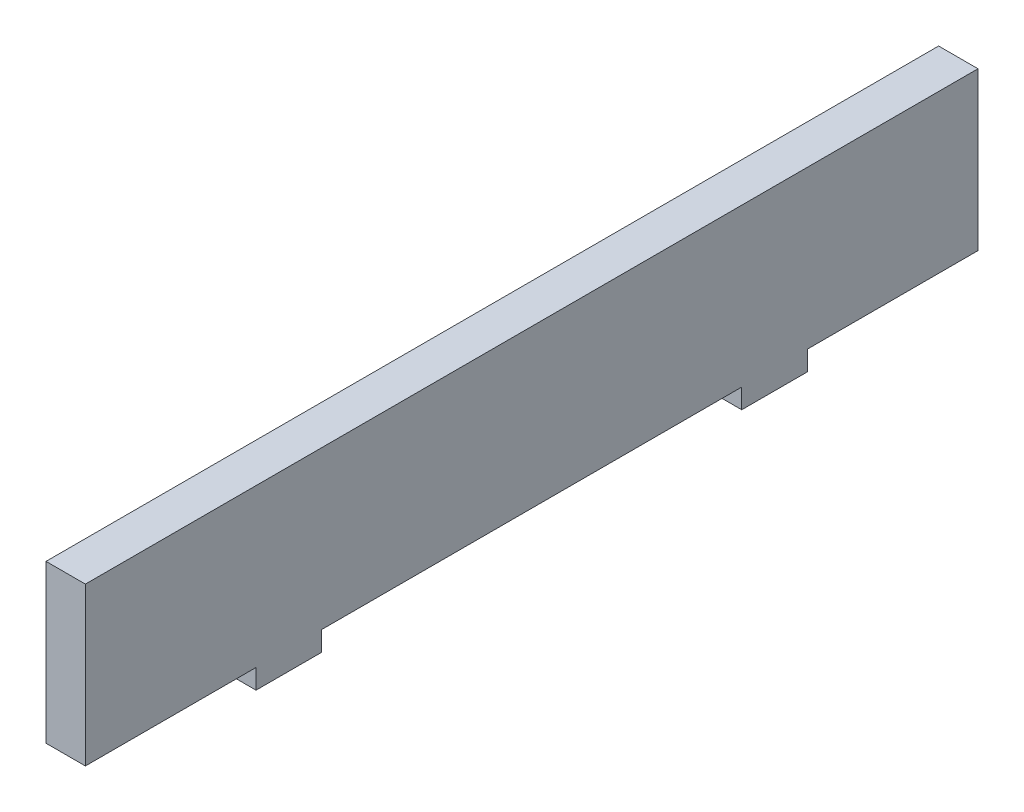
ISO-10303-21;
HEADER;
FILE_DESCRIPTION(('STEP AP214'),'2;1');
FILE_NAME('part.step','',(''),(''),'','','');
FILE_SCHEMA(('AUTOMOTIVE_DESIGN { 1 0 10303 214 1 1 1 1 }'));
ENDSEC;
DATA;
#1=APPLICATION_CONTEXT('core data for automotive mechanical design processes');
#2=APPLICATION_PROTOCOL_DEFINITION('international standard','automotive_design',2000,#1);
#3=PRODUCT_CONTEXT('',#1,'mechanical');
#4=PRODUCT('Part','Part','',(#3));
#5=PRODUCT_RELATED_PRODUCT_CATEGORY('part','',(#4));
#6=PRODUCT_DEFINITION_FORMATION('','',#4);
#7=PRODUCT_DEFINITION_CONTEXT('part definition',#1,'design');
#8=PRODUCT_DEFINITION('design','',#6,#7);
#9=PRODUCT_DEFINITION_SHAPE('','',#8);
#10=(LENGTH_UNIT() NAMED_UNIT(*) SI_UNIT(.MILLI.,.METRE.));
#11=(NAMED_UNIT(*) PLANE_ANGLE_UNIT() SI_UNIT($,.RADIAN.));
#12=(NAMED_UNIT(*) SI_UNIT($,.STERADIAN.) SOLID_ANGLE_UNIT());
#13=UNCERTAINTY_MEASURE_WITH_UNIT(LENGTH_MEASURE(1.E-05),#10,'distance_accuracy_value','');
#14=(GEOMETRIC_REPRESENTATION_CONTEXT(3) GLOBAL_UNCERTAINTY_ASSIGNED_CONTEXT((#13)) GLOBAL_UNIT_ASSIGNED_CONTEXT((#10,
#11,#12)) REPRESENTATION_CONTEXT('',''));
#15=CARTESIAN_POINT('',(0.,0.,0.));
#16=DIRECTION('',(0.,0.,1.));
#17=DIRECTION('',(1.,0.,0.));
#18=AXIS2_PLACEMENT_3D('',#15,#16,#17);
#19=CARTESIAN_POINT('',(0.,0.,0.));
#20=DIRECTION('',(0.,1.,0.));
#21=DIRECTION('',(0.,0.,1.));
#22=AXIS2_PLACEMENT_3D('',#19,#20,#21);
#23=PLANE('',#22);
#24=DIRECTION('',(0.,0.,-1.));
#25=VECTOR('',#24,1.);
#26=CARTESIAN_POINT('',(1.5,0.,34.));
#27=LINE('',#26,#25);
#28=CARTESIAN_POINT('',(1.5,0.,-21.));
#29=VERTEX_POINT('',#28);
#30=CARTESIAN_POINT('',(1.5,0.,-34.));
#31=VERTEX_POINT('',#30);
#32=EDGE_CURVE('E153',#29,#31,#27,.T.);
#33=ORIENTED_EDGE('',*,*,#32,.F.);
#34=DIRECTION('',(1.,0.,0.));
#35=VECTOR('',#34,1.);
#36=CARTESIAN_POINT('',(-6.72015325445528,0.,-21.));
#37=LINE('',#36,#35);
#38=CARTESIAN_POINT('',(-1.5,0.,-21.));
#39=VERTEX_POINT('',#38);
#40=EDGE_CURVE('E139',#39,#29,#37,.T.);
#41=ORIENTED_EDGE('',*,*,#40,.F.);
#42=DIRECTION('',(0.,0.,1.));
#43=VECTOR('',#42,1.);
#44=CARTESIAN_POINT('',(-1.5,0.,34.));
#45=LINE('',#44,#43);
#46=CARTESIAN_POINT('',(-1.5,0.,-34.));
#47=VERTEX_POINT('',#46);
#48=EDGE_CURVE('E152',#47,#39,#45,.T.);
#49=ORIENTED_EDGE('',*,*,#48,.F.);
#50=DIRECTION('',(-1.,0.,0.));
#51=VECTOR('',#50,1.);
#52=CARTESIAN_POINT('',(1.5,0.,-34.));
#53=LINE('',#52,#51);
#54=EDGE_CURVE('E191',#31,#47,#53,.T.);
#55=ORIENTED_EDGE('',*,*,#54,.F.);
#56=EDGE_LOOP('',(#33,#41,#49,#55));
#57=FACE_BOUND('',#56,.T.);
#58=ADVANCED_FACE('F45',(#57),#23,.F.);
#59=CARTESIAN_POINT('',(-1.5,0.,-16.));
#60=VERTEX_POINT('',#59);
#61=CARTESIAN_POINT('',(-1.5,0.,16.));
#62=VERTEX_POINT('',#61);
#63=EDGE_CURVE('E162',#60,#62,#45,.T.);
#64=ORIENTED_EDGE('',*,*,#63,.F.);
#65=DIRECTION('',(1.,0.,0.));
#66=VECTOR('',#65,1.);
#67=CARTESIAN_POINT('',(-6.72015325445528,0.,-16.));
#68=LINE('',#67,#66);
#69=CARTESIAN_POINT('',(1.5,0.,-16.));
#70=VERTEX_POINT('',#69);
#71=EDGE_CURVE('E281',#60,#70,#68,.T.);
#72=ORIENTED_EDGE('',*,*,#71,.T.);
#73=CARTESIAN_POINT('',(1.5,0.,16.));
#74=VERTEX_POINT('',#73);
#75=EDGE_CURVE('E220',#74,#70,#27,.T.);
#76=ORIENTED_EDGE('',*,*,#75,.F.);
#77=DIRECTION('',(1.,0.,0.));
#78=VECTOR('',#77,1.);
#79=CARTESIAN_POINT('',(-6.72015325445528,0.,16.));
#80=LINE('',#79,#78);
#81=EDGE_CURVE('E318',#62,#74,#80,.T.);
#82=ORIENTED_EDGE('',*,*,#81,.F.);
#83=EDGE_LOOP('',(#64,#72,#76,#82));
#84=FACE_BOUND('',#83,.T.);
#85=ADVANCED_FACE('F236',(#84),#23,.F.);
#86=CARTESIAN_POINT('',(-1.5,12.,34.));
#87=DIRECTION('',(1.,0.,0.));
#88=DIRECTION('',(0.,0.,-1.));
#89=AXIS2_PLACEMENT_3D('',#86,#87,#88);
#90=PLANE('',#89);
#91=ORIENTED_EDGE('',*,*,#48,.T.);
#92=DIRECTION('',(0.,-1.,0.));
#93=VECTOR('',#92,1.);
#94=CARTESIAN_POINT('',(-1.5,0.,-21.));
#95=LINE('',#94,#93);
#96=CARTESIAN_POINT('',(-1.5,-1.5,-21.));
#97=VERTEX_POINT('',#96);
#98=EDGE_CURVE('E136',#39,#97,#95,.T.);
#99=ORIENTED_EDGE('',*,*,#98,.T.);
#100=DIRECTION('',(0.,0.,1.));
#101=VECTOR('',#100,1.);
#102=CARTESIAN_POINT('',(-1.5,-1.5,-21.));
#103=LINE('',#102,#101);
#104=CARTESIAN_POINT('',(-1.5,-1.5,-16.));
#105=VERTEX_POINT('',#104);
#106=EDGE_CURVE('E146',#97,#105,#103,.T.);
#107=ORIENTED_EDGE('',*,*,#106,.T.);
#108=DIRECTION('',(0.,1.,0.));
#109=VECTOR('',#108,1.);
#110=CARTESIAN_POINT('',(-1.5,0.,-16.));
#111=LINE('',#110,#109);
#112=EDGE_CURVE('E147',#105,#60,#111,.T.);
#113=ORIENTED_EDGE('',*,*,#112,.T.);
#114=ORIENTED_EDGE('',*,*,#63,.T.);
#115=DIRECTION('',(0.,-1.,0.));
#116=VECTOR('',#115,1.);
#117=CARTESIAN_POINT('',(-1.5,0.,16.));
#118=LINE('',#117,#116);
#119=CARTESIAN_POINT('',(-1.5,-1.5,16.));
#120=VERTEX_POINT('',#119);
#121=EDGE_CURVE('E180',#62,#120,#118,.T.);
#122=ORIENTED_EDGE('',*,*,#121,.T.);
#123=DIRECTION('',(0.,0.,1.));
#124=VECTOR('',#123,1.);
#125=CARTESIAN_POINT('',(-1.5,-1.5,21.));
#126=LINE('',#125,#124);
#127=CARTESIAN_POINT('',(-1.5,-1.5,21.));
#128=VERTEX_POINT('',#127);
#129=EDGE_CURVE('E170',#120,#128,#126,.T.);
#130=ORIENTED_EDGE('',*,*,#129,.T.);
#131=DIRECTION('',(0.,1.,0.));
#132=VECTOR('',#131,1.);
#133=CARTESIAN_POINT('',(-1.5,0.,21.));
#134=LINE('',#133,#132);
#135=CARTESIAN_POINT('',(-1.5,0.,21.));
#136=VERTEX_POINT('',#135);
#137=EDGE_CURVE('E175',#128,#136,#134,.T.);
#138=ORIENTED_EDGE('',*,*,#137,.T.);
#139=CARTESIAN_POINT('',(-1.5,0.,34.));
#140=VERTEX_POINT('',#139);
#141=EDGE_CURVE('E164',#136,#140,#45,.T.);
#142=ORIENTED_EDGE('',*,*,#141,.T.);
#143=DIRECTION('',(0.,-1.,0.));
#144=VECTOR('',#143,1.);
#145=CARTESIAN_POINT('',(-1.5,12.,34.));
#146=LINE('',#145,#144);
#147=CARTESIAN_POINT('',(-1.5,12.,34.));
#148=VERTEX_POINT('',#147);
#149=EDGE_CURVE('E11',#148,#140,#146,.T.);
#150=ORIENTED_EDGE('',*,*,#149,.F.);
#151=DIRECTION('',(0.,0.,1.));
#152=VECTOR('',#151,1.);
#153=CARTESIAN_POINT('',(-1.5,12.,34.));
#154=LINE('',#153,#152);
#155=CARTESIAN_POINT('',(-1.5,12.,-34.));
#156=VERTEX_POINT('',#155);
#157=EDGE_CURVE('E186',#156,#148,#154,.T.);
#158=ORIENTED_EDGE('',*,*,#157,.F.);
#159=DIRECTION('',(0.,-1.,0.));
#160=VECTOR('',#159,1.);
#161=CARTESIAN_POINT('',(-1.5,12.,-34.));
#162=LINE('',#161,#160);
#163=EDGE_CURVE('E159',#156,#47,#162,.T.);
#164=ORIENTED_EDGE('',*,*,#163,.T.);
#165=EDGE_LOOP('',(#91,#99,#107,#113,#114,#122,#130,#138,#142,#150,#158,#164));
#166=FACE_BOUND('',#165,.T.);
#167=ADVANCED_FACE('F47',(#166),#90,.F.);
#168=CARTESIAN_POINT('',(1.5,12.,34.));
#169=DIRECTION('',(0.,0.,-1.));
#170=DIRECTION('',(-1.,0.,0.));
#171=AXIS2_PLACEMENT_3D('',#168,#169,#170);
#172=PLANE('',#171);
#173=DIRECTION('',(1.,0.,0.));
#174=VECTOR('',#173,1.);
#175=CARTESIAN_POINT('',(1.5,0.,34.));
#176=LINE('',#175,#174);
#177=CARTESIAN_POINT('',(1.5,0.,34.));
#178=VERTEX_POINT('',#177);
#179=EDGE_CURVE('E161',#140,#178,#176,.T.);
#180=ORIENTED_EDGE('',*,*,#179,.T.);
#181=DIRECTION('',(0.,-1.,0.));
#182=VECTOR('',#181,1.);
#183=CARTESIAN_POINT('',(1.5,12.,34.));
#184=LINE('',#183,#182);
#185=CARTESIAN_POINT('',(1.5,12.,34.));
#186=VERTEX_POINT('',#185);
#187=EDGE_CURVE('E54',#186,#178,#184,.T.);
#188=ORIENTED_EDGE('',*,*,#187,.F.);
#189=DIRECTION('',(1.,0.,0.));
#190=VECTOR('',#189,1.);
#191=CARTESIAN_POINT('',(1.5,12.,34.));
#192=LINE('',#191,#190);
#193=EDGE_CURVE('E190',#148,#186,#192,.T.);
#194=ORIENTED_EDGE('',*,*,#193,.F.);
#195=ORIENTED_EDGE('',*,*,#149,.T.);
#196=EDGE_LOOP('',(#180,#188,#194,#195));
#197=FACE_BOUND('',#196,.T.);
#198=ADVANCED_FACE('F228',(#197),#172,.F.);
#199=CARTESIAN_POINT('',(1.5,12.,34.));
#200=DIRECTION('',(-1.,0.,0.));
#201=DIRECTION('',(0.,0.,1.));
#202=AXIS2_PLACEMENT_3D('',#199,#200,#201);
#203=PLANE('',#202);
#204=CARTESIAN_POINT('',(1.5,0.,21.));
#205=VERTEX_POINT('',#204);
#206=EDGE_CURVE('E214',#178,#205,#27,.T.);
#207=ORIENTED_EDGE('',*,*,#206,.T.);
#208=DIRECTION('',(0.,-1.,0.));
#209=VECTOR('',#208,1.);
#210=CARTESIAN_POINT('',(1.5,0.,21.));
#211=LINE('',#210,#209);
#212=CARTESIAN_POINT('',(1.5,-1.5,21.));
#213=VERTEX_POINT('',#212);
#214=EDGE_CURVE('E300',#205,#213,#211,.T.);
#215=ORIENTED_EDGE('',*,*,#214,.T.);
#216=DIRECTION('',(0.,0.,-1.));
#217=VECTOR('',#216,1.);
#218=CARTESIAN_POINT('',(1.5,-1.5,21.));
#219=LINE('',#218,#217);
#220=CARTESIAN_POINT('',(1.5,-1.5,16.));
#221=VERTEX_POINT('',#220);
#222=EDGE_CURVE('E308',#213,#221,#219,.T.);
#223=ORIENTED_EDGE('',*,*,#222,.T.);
#224=DIRECTION('',(0.,1.,0.));
#225=VECTOR('',#224,1.);
#226=CARTESIAN_POINT('',(1.5,0.,16.));
#227=LINE('',#226,#225);
#228=EDGE_CURVE('E312',#221,#74,#227,.T.);
#229=ORIENTED_EDGE('',*,*,#228,.T.);
#230=ORIENTED_EDGE('',*,*,#75,.T.);
#231=DIRECTION('',(0.,-1.,0.));
#232=VECTOR('',#231,1.);
#233=CARTESIAN_POINT('',(1.5,0.,-16.));
#234=LINE('',#233,#232);
#235=CARTESIAN_POINT('',(1.5,-1.5,-16.));
#236=VERTEX_POINT('',#235);
#237=EDGE_CURVE('E297',#70,#236,#234,.T.);
#238=ORIENTED_EDGE('',*,*,#237,.T.);
#239=DIRECTION('',(0.,0.,-1.));
#240=VECTOR('',#239,1.);
#241=CARTESIAN_POINT('',(1.5,-1.5,-21.));
#242=LINE('',#241,#240);
#243=CARTESIAN_POINT('',(1.5,-1.5,-21.));
#244=VERTEX_POINT('',#243);
#245=EDGE_CURVE('E294',#236,#244,#242,.T.);
#246=ORIENTED_EDGE('',*,*,#245,.T.);
#247=DIRECTION('',(0.,1.,0.));
#248=VECTOR('',#247,1.);
#249=CARTESIAN_POINT('',(1.5,0.,-21.));
#250=LINE('',#249,#248);
#251=EDGE_CURVE('E61',#244,#29,#250,.T.);
#252=ORIENTED_EDGE('',*,*,#251,.T.);
#253=ORIENTED_EDGE('',*,*,#32,.T.);
#254=DIRECTION('',(0.,-1.,0.));
#255=VECTOR('',#254,1.);
#256=CARTESIAN_POINT('',(1.5,12.,-34.));
#257=LINE('',#256,#255);
#258=CARTESIAN_POINT('',(1.5,12.,-34.));
#259=VERTEX_POINT('',#258);
#260=EDGE_CURVE('E201',#259,#31,#257,.T.);
#261=ORIENTED_EDGE('',*,*,#260,.F.);
#262=DIRECTION('',(0.,0.,-1.));
#263=VECTOR('',#262,1.);
#264=CARTESIAN_POINT('',(1.5,12.,34.));
#265=LINE('',#264,#263);
#266=EDGE_CURVE('E194',#186,#259,#265,.T.);
#267=ORIENTED_EDGE('',*,*,#266,.F.);
#268=ORIENTED_EDGE('',*,*,#187,.T.);
#269=EDGE_LOOP('',(#207,#215,#223,#229,#230,#238,#246,#252,#253,#261,#267,#268));
#270=FACE_BOUND('',#269,.T.);
#271=ADVANCED_FACE('F212',(#270),#203,.F.);
#272=CARTESIAN_POINT('',(1.5,12.,-34.));
#273=DIRECTION('',(0.,0.,1.));
#274=DIRECTION('',(1.,0.,0.));
#275=AXIS2_PLACEMENT_3D('',#272,#273,#274);
#276=PLANE('',#275);
#277=ORIENTED_EDGE('',*,*,#54,.T.);
#278=ORIENTED_EDGE('',*,*,#163,.F.);
#279=DIRECTION('',(-1.,0.,0.));
#280=VECTOR('',#279,1.);
#281=CARTESIAN_POINT('',(1.5,12.,-34.));
#282=LINE('',#281,#280);
#283=EDGE_CURVE('E196',#259,#156,#282,.T.);
#284=ORIENTED_EDGE('',*,*,#283,.F.);
#285=ORIENTED_EDGE('',*,*,#260,.T.);
#286=EDGE_LOOP('',(#277,#278,#284,#285));
#287=FACE_BOUND('',#286,.T.);
#288=ADVANCED_FACE('F226',(#287),#276,.F.);
#289=CARTESIAN_POINT('',(0.,12.,0.));
#290=DIRECTION('',(0.,1.,0.));
#291=DIRECTION('',(0.,0.,1.));
#292=AXIS2_PLACEMENT_3D('',#289,#290,#291);
#293=PLANE('',#292);
#294=ORIENTED_EDGE('',*,*,#157,.T.);
#295=ORIENTED_EDGE('',*,*,#193,.T.);
#296=ORIENTED_EDGE('',*,*,#266,.T.);
#297=ORIENTED_EDGE('',*,*,#283,.T.);
#298=EDGE_LOOP('',(#294,#295,#296,#297));
#299=FACE_BOUND('',#298,.T.);
#300=ADVANCED_FACE('F227',(#299),#293,.T.);
#301=ORIENTED_EDGE('',*,*,#141,.F.);
#302=DIRECTION('',(1.,0.,0.));
#303=VECTOR('',#302,1.);
#304=CARTESIAN_POINT('',(-6.72015325445528,0.,21.));
#305=LINE('',#304,#303);
#306=EDGE_CURVE('E69',#136,#205,#305,.T.);
#307=ORIENTED_EDGE('',*,*,#306,.T.);
#308=ORIENTED_EDGE('',*,*,#206,.F.);
#309=ORIENTED_EDGE('',*,*,#179,.F.);
#310=EDGE_LOOP('',(#301,#307,#308,#309));
#311=FACE_BOUND('',#310,.T.);
#312=ADVANCED_FACE('F218',(#311),#23,.F.);
#313=CARTESIAN_POINT('',(-6.72015325445528,0.,21.));
#314=DIRECTION('',(0.,0.,1.));
#315=DIRECTION('',(1.,0.,0.));
#316=AXIS2_PLACEMENT_3D('',#313,#314,#315);
#317=PLANE('',#316);
#318=ORIENTED_EDGE('',*,*,#137,.F.);
#319=DIRECTION('',(1.,0.,0.));
#320=VECTOR('',#319,1.);
#321=CARTESIAN_POINT('',(-6.72015325445528,-1.5,21.));
#322=LINE('',#321,#320);
#323=EDGE_CURVE('E184',#128,#213,#322,.T.);
#324=ORIENTED_EDGE('',*,*,#323,.T.);
#325=ORIENTED_EDGE('',*,*,#214,.F.);
#326=ORIENTED_EDGE('',*,*,#306,.F.);
#327=EDGE_LOOP('',(#318,#324,#325,#326));
#328=FACE_BOUND('',#327,.T.);
#329=ADVANCED_FACE('F247',(#328),#317,.T.);
#330=CARTESIAN_POINT('',(-6.72015325445528,0.,16.));
#331=DIRECTION('',(0.,0.,-1.));
#332=DIRECTION('',(-1.,0.,0.));
#333=AXIS2_PLACEMENT_3D('',#330,#331,#332);
#334=PLANE('',#333);
#335=ORIENTED_EDGE('',*,*,#121,.F.);
#336=ORIENTED_EDGE('',*,*,#81,.T.);
#337=ORIENTED_EDGE('',*,*,#228,.F.);
#338=DIRECTION('',(1.,0.,0.));
#339=VECTOR('',#338,1.);
#340=CARTESIAN_POINT('',(-6.72015325445528,-1.5,16.));
#341=LINE('',#340,#339);
#342=EDGE_CURVE('E321',#120,#221,#341,.T.);
#343=ORIENTED_EDGE('',*,*,#342,.F.);
#344=EDGE_LOOP('',(#335,#336,#337,#343));
#345=FACE_BOUND('',#344,.T.);
#346=ADVANCED_FACE('F251',(#345),#334,.T.);
#347=CARTESIAN_POINT('',(-6.72015325445528,-1.5,21.));
#348=DIRECTION('',(0.,-1.,0.));
#349=DIRECTION('',(0.,0.,-1.));
#350=AXIS2_PLACEMENT_3D('',#347,#348,#349);
#351=PLANE('',#350);
#352=ORIENTED_EDGE('',*,*,#129,.F.);
#353=ORIENTED_EDGE('',*,*,#342,.T.);
#354=ORIENTED_EDGE('',*,*,#222,.F.);
#355=ORIENTED_EDGE('',*,*,#323,.F.);
#356=EDGE_LOOP('',(#352,#353,#354,#355));
#357=FACE_BOUND('',#356,.T.);
#358=ADVANCED_FACE('F257',(#357),#351,.T.);
#359=CARTESIAN_POINT('',(-6.72015325445528,0.,-21.));
#360=DIRECTION('',(0.,0.,-1.));
#361=DIRECTION('',(-1.,0.,0.));
#362=AXIS2_PLACEMENT_3D('',#359,#360,#361);
#363=PLANE('',#362);
#364=ORIENTED_EDGE('',*,*,#98,.F.);
#365=ORIENTED_EDGE('',*,*,#40,.T.);
#366=ORIENTED_EDGE('',*,*,#251,.F.);
#367=DIRECTION('',(1.,0.,0.));
#368=VECTOR('',#367,1.);
#369=CARTESIAN_POINT('',(-6.72015325445528,-1.5,-21.));
#370=LINE('',#369,#368);
#371=EDGE_CURVE('E141',#97,#244,#370,.T.);
#372=ORIENTED_EDGE('',*,*,#371,.F.);
#373=EDGE_LOOP('',(#364,#365,#366,#372));
#374=FACE_BOUND('',#373,.T.);
#375=ADVANCED_FACE('F138',(#374),#363,.T.);
#376=CARTESIAN_POINT('',(-6.72015325445528,-1.5,-21.));
#377=DIRECTION('',(0.,-1.,0.));
#378=DIRECTION('',(0.,0.,-1.));
#379=AXIS2_PLACEMENT_3D('',#376,#377,#378);
#380=PLANE('',#379);
#381=ORIENTED_EDGE('',*,*,#106,.F.);
#382=ORIENTED_EDGE('',*,*,#371,.T.);
#383=ORIENTED_EDGE('',*,*,#245,.F.);
#384=DIRECTION('',(1.,0.,0.));
#385=VECTOR('',#384,1.);
#386=CARTESIAN_POINT('',(-6.72015325445528,-1.5,-16.));
#387=LINE('',#386,#385);
#388=EDGE_CURVE('E278',#105,#236,#387,.T.);
#389=ORIENTED_EDGE('',*,*,#388,.F.);
#390=EDGE_LOOP('',(#381,#382,#383,#389));
#391=FACE_BOUND('',#390,.T.);
#392=ADVANCED_FACE('F266',(#391),#380,.T.);
#393=CARTESIAN_POINT('',(-6.72015325445528,0.,-16.));
#394=DIRECTION('',(0.,0.,1.));
#395=DIRECTION('',(1.,0.,0.));
#396=AXIS2_PLACEMENT_3D('',#393,#394,#395);
#397=PLANE('',#396);
#398=ORIENTED_EDGE('',*,*,#112,.F.);
#399=ORIENTED_EDGE('',*,*,#388,.T.);
#400=ORIENTED_EDGE('',*,*,#237,.F.);
#401=ORIENTED_EDGE('',*,*,#71,.F.);
#402=EDGE_LOOP('',(#398,#399,#400,#401));
#403=FACE_BOUND('',#402,.T.);
#404=ADVANCED_FACE('F269',(#403),#397,.T.);
#405=CLOSED_SHELL('',(#58,#85,#167,#198,#271,#288,#300,#312,#329,#346,#358,#375,#392,#404));
#406=MANIFOLD_SOLID_BREP('B2',#405);
#407=ADVANCED_BREP_SHAPE_REPRESENTATION('',(#18,#406),#14);
#408=SHAPE_DEFINITION_REPRESENTATION(#9,#407);
ENDSEC;
END-ISO-10303-21;
